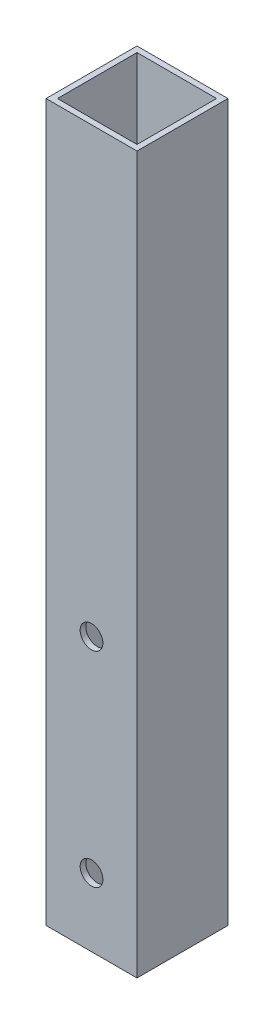
ISO-10303-21;
HEADER;
FILE_DESCRIPTION(('STEP AP214'),'2;1');
FILE_NAME('part.step','',(''),(''),'','','');
FILE_SCHEMA(('AUTOMOTIVE_DESIGN { 1 0 10303 214 1 1 1 1 }'));
ENDSEC;
DATA;
#1=APPLICATION_CONTEXT('core data for automotive mechanical design processes');
#2=APPLICATION_PROTOCOL_DEFINITION('international standard','automotive_design',2000,#1);
#3=PRODUCT_CONTEXT('',#1,'mechanical');
#4=PRODUCT('Part','Part','',(#3));
#5=PRODUCT_RELATED_PRODUCT_CATEGORY('part','',(#4));
#6=PRODUCT_DEFINITION_FORMATION('','',#4);
#7=PRODUCT_DEFINITION_CONTEXT('part definition',#1,'design');
#8=PRODUCT_DEFINITION('design','',#6,#7);
#9=PRODUCT_DEFINITION_SHAPE('','',#8);
#10=(LENGTH_UNIT() NAMED_UNIT(*) SI_UNIT(.MILLI.,.METRE.));
#11=(NAMED_UNIT(*) PLANE_ANGLE_UNIT() SI_UNIT($,.RADIAN.));
#12=(NAMED_UNIT(*) SI_UNIT($,.STERADIAN.) SOLID_ANGLE_UNIT());
#13=UNCERTAINTY_MEASURE_WITH_UNIT(LENGTH_MEASURE(1.E-05),#10,'distance_accuracy_value','');
#14=(GEOMETRIC_REPRESENTATION_CONTEXT(3) GLOBAL_UNCERTAINTY_ASSIGNED_CONTEXT((#13)) GLOBAL_UNIT_ASSIGNED_CONTEXT((#10,
#11,#12)) REPRESENTATION_CONTEXT('',''));
#15=CARTESIAN_POINT('',(0.,0.,0.));
#16=DIRECTION('',(0.,0.,1.));
#17=DIRECTION('',(1.,0.,0.));
#18=AXIS2_PLACEMENT_3D('',#15,#16,#17);
#19=CARTESIAN_POINT('',(0.,200.,0.));
#20=DIRECTION('',(0.,-1.,0.));
#21=DIRECTION('',(0.,0.,-1.));
#22=AXIS2_PLACEMENT_3D('',#19,#20,#21);
#23=PLANE('',#22);
#24=DIRECTION('',(0.,0.,-1.));
#25=VECTOR('',#24,1.);
#26=CARTESIAN_POINT('',(12.7,200.,12.7));
#27=LINE('',#26,#25);
#28=CARTESIAN_POINT('',(12.7,200.,12.7));
#29=VERTEX_POINT('',#28);
#30=CARTESIAN_POINT('',(12.7,200.,-12.7));
#31=VERTEX_POINT('',#30);
#32=EDGE_CURVE('E138',#29,#31,#27,.T.);
#33=ORIENTED_EDGE('',*,*,#32,.T.);
#34=DIRECTION('',(-1.,0.,0.));
#35=VECTOR('',#34,1.);
#36=CARTESIAN_POINT('',(-12.7,200.,-12.7));
#37=LINE('',#36,#35);
#38=CARTESIAN_POINT('',(-12.7,200.,-12.7));
#39=VERTEX_POINT('',#38);
#40=EDGE_CURVE('E141',#31,#39,#37,.T.);
#41=ORIENTED_EDGE('',*,*,#40,.T.);
#42=DIRECTION('',(0.,0.,1.));
#43=VECTOR('',#42,1.);
#44=CARTESIAN_POINT('',(-12.7,200.,12.7));
#45=LINE('',#44,#43);
#46=CARTESIAN_POINT('',(-12.7,200.,12.7));
#47=VERTEX_POINT('',#46);
#48=EDGE_CURVE('E144',#39,#47,#45,.T.);
#49=ORIENTED_EDGE('',*,*,#48,.T.);
#50=DIRECTION('',(1.,0.,0.));
#51=VECTOR('',#50,1.);
#52=CARTESIAN_POINT('',(-12.7,200.,12.7));
#53=LINE('',#52,#51);
#54=EDGE_CURVE('E146',#47,#29,#53,.T.);
#55=ORIENTED_EDGE('',*,*,#54,.T.);
#56=EDGE_LOOP('',(#33,#41,#49,#55));
#57=FACE_BOUND('',#56,.T.);
#58=DIRECTION('',(0.,0.,-1.));
#59=VECTOR('',#58,1.);
#60=CARTESIAN_POINT('',(11.1125,200.,11.1125));
#61=LINE('',#60,#59);
#62=CARTESIAN_POINT('',(11.1125,200.,11.1125));
#63=VERTEX_POINT('',#62);
#64=CARTESIAN_POINT('',(11.1125,200.,-11.1125));
#65=VERTEX_POINT('',#64);
#66=EDGE_CURVE('E100',#63,#65,#61,.T.);
#67=ORIENTED_EDGE('',*,*,#66,.F.);
#68=DIRECTION('',(1.,0.,0.));
#69=VECTOR('',#68,1.);
#70=CARTESIAN_POINT('',(-11.1125,200.,11.1125));
#71=LINE('',#70,#69);
#72=CARTESIAN_POINT('',(-11.1125,200.,11.1125));
#73=VERTEX_POINT('',#72);
#74=EDGE_CURVE('E122',#73,#63,#71,.T.);
#75=ORIENTED_EDGE('',*,*,#74,.F.);
#76=DIRECTION('',(0.,0.,1.));
#77=VECTOR('',#76,1.);
#78=CARTESIAN_POINT('',(-11.1125,200.,11.1125));
#79=LINE('',#78,#77);
#80=CARTESIAN_POINT('',(-11.1125,200.,-11.1125));
#81=VERTEX_POINT('',#80);
#82=EDGE_CURVE('E120',#81,#73,#79,.T.);
#83=ORIENTED_EDGE('',*,*,#82,.F.);
#84=DIRECTION('',(-1.,0.,0.));
#85=VECTOR('',#84,1.);
#86=CARTESIAN_POINT('',(-11.1125,200.,-11.1125));
#87=LINE('',#86,#85);
#88=EDGE_CURVE('E108',#65,#81,#87,.T.);
#89=ORIENTED_EDGE('',*,*,#88,.F.);
#90=EDGE_LOOP('',(#67,#75,#83,#89));
#91=FACE_BOUND('',#90,.T.);
#92=ADVANCED_FACE('F33',(#57,#91),#23,.F.);
#93=CARTESIAN_POINT('',(0.,0.,0.));
#94=DIRECTION('',(0.,-1.,0.));
#95=DIRECTION('',(0.,0.,-1.));
#96=AXIS2_PLACEMENT_3D('',#93,#94,#95);
#97=PLANE('',#96);
#98=DIRECTION('',(0.,0.,-1.));
#99=VECTOR('',#98,1.);
#100=CARTESIAN_POINT('',(12.7,0.,12.7));
#101=LINE('',#100,#99);
#102=CARTESIAN_POINT('',(12.7,0.,12.7));
#103=VERTEX_POINT('',#102);
#104=CARTESIAN_POINT('',(12.7,0.,-12.7));
#105=VERTEX_POINT('',#104);
#106=EDGE_CURVE('E116',#103,#105,#101,.T.);
#107=ORIENTED_EDGE('',*,*,#106,.F.);
#108=DIRECTION('',(1.,0.,0.));
#109=VECTOR('',#108,1.);
#110=CARTESIAN_POINT('',(-12.7,0.,12.7));
#111=LINE('',#110,#109);
#112=CARTESIAN_POINT('',(-12.7,0.,12.7));
#113=VERTEX_POINT('',#112);
#114=EDGE_CURVE('E142',#113,#103,#111,.T.);
#115=ORIENTED_EDGE('',*,*,#114,.F.);
#116=DIRECTION('',(0.,0.,1.));
#117=VECTOR('',#116,1.);
#118=CARTESIAN_POINT('',(-12.7,0.,12.7));
#119=LINE('',#118,#117);
#120=CARTESIAN_POINT('',(-12.7,0.,-12.7));
#121=VERTEX_POINT('',#120);
#122=EDGE_CURVE('E153',#121,#113,#119,.T.);
#123=ORIENTED_EDGE('',*,*,#122,.F.);
#124=DIRECTION('',(-1.,0.,0.));
#125=VECTOR('',#124,1.);
#126=CARTESIAN_POINT('',(-12.7,0.,-12.7));
#127=LINE('',#126,#125);
#128=EDGE_CURVE('E151',#105,#121,#127,.T.);
#129=ORIENTED_EDGE('',*,*,#128,.F.);
#130=EDGE_LOOP('',(#107,#115,#123,#129));
#131=FACE_BOUND('',#130,.T.);
#132=DIRECTION('',(1.,0.,0.));
#133=VECTOR('',#132,1.);
#134=CARTESIAN_POINT('',(-11.1125,0.,11.1125));
#135=LINE('',#134,#133);
#136=CARTESIAN_POINT('',(-11.1125,0.,11.1125));
#137=VERTEX_POINT('',#136);
#138=CARTESIAN_POINT('',(11.1125,0.,11.1125));
#139=VERTEX_POINT('',#138);
#140=EDGE_CURVE('E109',#137,#139,#135,.T.);
#141=ORIENTED_EDGE('',*,*,#140,.T.);
#142=DIRECTION('',(0.,0.,-1.));
#143=VECTOR('',#142,1.);
#144=CARTESIAN_POINT('',(11.1125,0.,11.1125));
#145=LINE('',#144,#143);
#146=CARTESIAN_POINT('',(11.1125,0.,-11.1125));
#147=VERTEX_POINT('',#146);
#148=EDGE_CURVE('E58',#139,#147,#145,.T.);
#149=ORIENTED_EDGE('',*,*,#148,.T.);
#150=DIRECTION('',(-1.,0.,0.));
#151=VECTOR('',#150,1.);
#152=CARTESIAN_POINT('',(-11.1125,0.,-11.1125));
#153=LINE('',#152,#151);
#154=CARTESIAN_POINT('',(-11.1125,0.,-11.1125));
#155=VERTEX_POINT('',#154);
#156=EDGE_CURVE('E115',#147,#155,#153,.T.);
#157=ORIENTED_EDGE('',*,*,#156,.T.);
#158=DIRECTION('',(0.,0.,1.));
#159=VECTOR('',#158,1.);
#160=CARTESIAN_POINT('',(-11.1125,0.,11.1125));
#161=LINE('',#160,#159);
#162=EDGE_CURVE('E130',#155,#137,#161,.T.);
#163=ORIENTED_EDGE('',*,*,#162,.T.);
#164=EDGE_LOOP('',(#141,#149,#157,#163));
#165=FACE_BOUND('',#164,.T.);
#166=ADVANCED_FACE('F200',(#131,#165),#97,.T.);
#167=CARTESIAN_POINT('',(12.7,200.,12.7));
#168=DIRECTION('',(-1.,0.,0.));
#169=DIRECTION('',(0.,0.,1.));
#170=AXIS2_PLACEMENT_3D('',#167,#168,#169);
#171=PLANE('',#170);
#172=ORIENTED_EDGE('',*,*,#106,.T.);
#173=DIRECTION('',(0.,-1.,0.));
#174=VECTOR('',#173,1.);
#175=CARTESIAN_POINT('',(12.7,200.,-12.7));
#176=LINE('',#175,#174);
#177=EDGE_CURVE('E11',#31,#105,#176,.T.);
#178=ORIENTED_EDGE('',*,*,#177,.F.);
#179=ORIENTED_EDGE('',*,*,#32,.F.);
#180=DIRECTION('',(0.,-1.,0.));
#181=VECTOR('',#180,1.);
#182=CARTESIAN_POINT('',(12.7,200.,12.7));
#183=LINE('',#182,#181);
#184=EDGE_CURVE('E148',#29,#103,#183,.T.);
#185=ORIENTED_EDGE('',*,*,#184,.T.);
#186=EDGE_LOOP('',(#172,#178,#179,#185));
#187=FACE_BOUND('',#186,.T.);
#188=ADVANCED_FACE('F35',(#187),#171,.F.);
#189=CARTESIAN_POINT('',(-12.7,200.,-12.7));
#190=DIRECTION('',(0.,0.,1.));
#191=DIRECTION('',(1.,0.,0.));
#192=AXIS2_PLACEMENT_3D('',#189,#190,#191);
#193=PLANE('',#192);
#194=CARTESIAN_POINT('',(0.,19.05,-12.7));
#195=DIRECTION('',(0.,0.,-1.));
#196=DIRECTION('',(-1.,0.,0.));
#197=AXIS2_PLACEMENT_3D('',#194,#195,#196);
#198=CIRCLE('',#197,3.175);
#199=CARTESIAN_POINT('',(-3.175,19.05,-12.7));
#200=VERTEX_POINT('',#199);
#201=EDGE_CURVE('E179',#200,#200,#198,.T.);
#202=ORIENTED_EDGE('',*,*,#201,.F.);
#203=EDGE_LOOP('',(#202));
#204=FACE_BOUND('',#203,.T.);
#205=CARTESIAN_POINT('',(0.,76.2,-12.7));
#206=DIRECTION('',(0.,0.,-1.));
#207=DIRECTION('',(-1.,0.,0.));
#208=AXIS2_PLACEMENT_3D('',#205,#206,#207);
#209=CIRCLE('',#208,3.175);
#210=CARTESIAN_POINT('',(-3.175,76.2,-12.7));
#211=VERTEX_POINT('',#210);
#212=EDGE_CURVE('E169',#211,#211,#209,.T.);
#213=ORIENTED_EDGE('',*,*,#212,.F.);
#214=EDGE_LOOP('',(#213));
#215=FACE_BOUND('',#214,.T.);
#216=ORIENTED_EDGE('',*,*,#128,.T.);
#217=DIRECTION('',(0.,-1.,0.));
#218=VECTOR('',#217,1.);
#219=CARTESIAN_POINT('',(-12.7,200.,-12.7));
#220=LINE('',#219,#218);
#221=EDGE_CURVE('E42',#39,#121,#220,.T.);
#222=ORIENTED_EDGE('',*,*,#221,.F.);
#223=ORIENTED_EDGE('',*,*,#40,.F.);
#224=ORIENTED_EDGE('',*,*,#177,.T.);
#225=EDGE_LOOP('',(#216,#222,#223,#224));
#226=FACE_BOUND('',#225,.T.);
#227=ADVANCED_FACE('F224',(#204,#215,#226),#193,.F.);
#228=CARTESIAN_POINT('',(-12.7,200.,12.7));
#229=DIRECTION('',(1.,0.,0.));
#230=DIRECTION('',(0.,0.,-1.));
#231=AXIS2_PLACEMENT_3D('',#228,#229,#230);
#232=PLANE('',#231);
#233=ORIENTED_EDGE('',*,*,#122,.T.);
#234=DIRECTION('',(0.,-1.,0.));
#235=VECTOR('',#234,1.);
#236=CARTESIAN_POINT('',(-12.7,200.,12.7));
#237=LINE('',#236,#235);
#238=EDGE_CURVE('E158',#47,#113,#237,.T.);
#239=ORIENTED_EDGE('',*,*,#238,.F.);
#240=ORIENTED_EDGE('',*,*,#48,.F.);
#241=ORIENTED_EDGE('',*,*,#221,.T.);
#242=EDGE_LOOP('',(#233,#239,#240,#241));
#243=FACE_BOUND('',#242,.T.);
#244=ADVANCED_FACE('F222',(#243),#232,.F.);
#245=CARTESIAN_POINT('',(-12.7,200.,12.7));
#246=DIRECTION('',(0.,0.,-1.));
#247=DIRECTION('',(-1.,0.,0.));
#248=AXIS2_PLACEMENT_3D('',#245,#246,#247);
#249=PLANE('',#248);
#250=CARTESIAN_POINT('',(0.,19.05,12.7));
#251=DIRECTION('',(0.,0.,-1.));
#252=DIRECTION('',(-1.,0.,0.));
#253=AXIS2_PLACEMENT_3D('',#250,#251,#252);
#254=CIRCLE('',#253,3.175);
#255=CARTESIAN_POINT('',(-3.175,19.05,12.7));
#256=VERTEX_POINT('',#255);
#257=EDGE_CURVE('E182',#256,#256,#254,.T.);
#258=ORIENTED_EDGE('',*,*,#257,.T.);
#259=EDGE_LOOP('',(#258));
#260=FACE_BOUND('',#259,.T.);
#261=CARTESIAN_POINT('',(0.,76.2,12.7));
#262=DIRECTION('',(0.,0.,-1.));
#263=DIRECTION('',(-1.,0.,0.));
#264=AXIS2_PLACEMENT_3D('',#261,#262,#263);
#265=CIRCLE('',#264,3.175);
#266=CARTESIAN_POINT('',(-3.175,76.2,12.7));
#267=VERTEX_POINT('',#266);
#268=EDGE_CURVE('E164',#267,#267,#265,.T.);
#269=ORIENTED_EDGE('',*,*,#268,.T.);
#270=EDGE_LOOP('',(#269));
#271=FACE_BOUND('',#270,.T.);
#272=ORIENTED_EDGE('',*,*,#114,.T.);
#273=ORIENTED_EDGE('',*,*,#184,.F.);
#274=ORIENTED_EDGE('',*,*,#54,.F.);
#275=ORIENTED_EDGE('',*,*,#238,.T.);
#276=EDGE_LOOP('',(#272,#273,#274,#275));
#277=FACE_BOUND('',#276,.T.);
#278=ADVANCED_FACE('F219',(#260,#271,#277),#249,.F.);
#279=CARTESIAN_POINT('',(11.1125,200.,11.1125));
#280=DIRECTION('',(-1.,0.,0.));
#281=DIRECTION('',(0.,0.,1.));
#282=AXIS2_PLACEMENT_3D('',#279,#280,#281);
#283=PLANE('',#282);
#284=ORIENTED_EDGE('',*,*,#148,.F.);
#285=DIRECTION('',(0.,-1.,0.));
#286=VECTOR('',#285,1.);
#287=CARTESIAN_POINT('',(11.1125,200.,11.1125));
#288=LINE('',#287,#286);
#289=EDGE_CURVE('E104',#63,#139,#288,.T.);
#290=ORIENTED_EDGE('',*,*,#289,.F.);
#291=ORIENTED_EDGE('',*,*,#66,.T.);
#292=DIRECTION('',(0.,-1.,0.));
#293=VECTOR('',#292,1.);
#294=CARTESIAN_POINT('',(11.1125,200.,-11.1125));
#295=LINE('',#294,#293);
#296=EDGE_CURVE('E103',#65,#147,#295,.T.);
#297=ORIENTED_EDGE('',*,*,#296,.T.);
#298=EDGE_LOOP('',(#284,#290,#291,#297));
#299=FACE_BOUND('',#298,.T.);
#300=ADVANCED_FACE('F102',(#299),#283,.T.);
#301=CARTESIAN_POINT('',(-11.1125,200.,-11.1125));
#302=DIRECTION('',(0.,0.,1.));
#303=DIRECTION('',(1.,0.,0.));
#304=AXIS2_PLACEMENT_3D('',#301,#302,#303);
#305=PLANE('',#304);
#306=CARTESIAN_POINT('',(0.,19.05,-11.1125));
#307=DIRECTION('',(0.,0.,1.));
#308=DIRECTION('',(1.,0.,0.));
#309=AXIS2_PLACEMENT_3D('',#306,#307,#308);
#310=CIRCLE('',#309,3.175);
#311=CARTESIAN_POINT('',(3.175,19.05,-11.1125));
#312=VERTEX_POINT('',#311);
#313=EDGE_CURVE('E174',#312,#312,#310,.T.);
#314=ORIENTED_EDGE('',*,*,#313,.F.);
#315=EDGE_LOOP('',(#314));
#316=FACE_BOUND('',#315,.T.);
#317=CARTESIAN_POINT('',(0.,76.2,-11.1125));
#318=DIRECTION('',(0.,0.,1.));
#319=DIRECTION('',(1.,0.,0.));
#320=AXIS2_PLACEMENT_3D('',#317,#318,#319);
#321=CIRCLE('',#320,3.175);
#322=CARTESIAN_POINT('',(3.175,76.2,-11.1125));
#323=VERTEX_POINT('',#322);
#324=EDGE_CURVE('E128',#323,#323,#321,.T.);
#325=ORIENTED_EDGE('',*,*,#324,.F.);
#326=EDGE_LOOP('',(#325));
#327=FACE_BOUND('',#326,.T.);
#328=ORIENTED_EDGE('',*,*,#156,.F.);
#329=ORIENTED_EDGE('',*,*,#296,.F.);
#330=ORIENTED_EDGE('',*,*,#88,.T.);
#331=DIRECTION('',(0.,-1.,0.));
#332=VECTOR('',#331,1.);
#333=CARTESIAN_POINT('',(-11.1125,200.,-11.1125));
#334=LINE('',#333,#332);
#335=EDGE_CURVE('E117',#81,#155,#334,.T.);
#336=ORIENTED_EDGE('',*,*,#335,.T.);
#337=EDGE_LOOP('',(#328,#329,#330,#336));
#338=FACE_BOUND('',#337,.T.);
#339=ADVANCED_FACE('F112',(#316,#327,#338),#305,.T.);
#340=CARTESIAN_POINT('',(-11.1125,200.,11.1125));
#341=DIRECTION('',(1.,0.,0.));
#342=DIRECTION('',(0.,0.,-1.));
#343=AXIS2_PLACEMENT_3D('',#340,#341,#342);
#344=PLANE('',#343);
#345=ORIENTED_EDGE('',*,*,#162,.F.);
#346=ORIENTED_EDGE('',*,*,#335,.F.);
#347=ORIENTED_EDGE('',*,*,#82,.T.);
#348=DIRECTION('',(0.,-1.,0.));
#349=VECTOR('',#348,1.);
#350=CARTESIAN_POINT('',(-11.1125,200.,11.1125));
#351=LINE('',#350,#349);
#352=EDGE_CURVE('E50',#73,#137,#351,.T.);
#353=ORIENTED_EDGE('',*,*,#352,.T.);
#354=EDGE_LOOP('',(#345,#346,#347,#353));
#355=FACE_BOUND('',#354,.T.);
#356=ADVANCED_FACE('F196',(#355),#344,.T.);
#357=CARTESIAN_POINT('',(-11.1125,200.,11.1125));
#358=DIRECTION('',(0.,0.,-1.));
#359=DIRECTION('',(-1.,0.,0.));
#360=AXIS2_PLACEMENT_3D('',#357,#358,#359);
#361=PLANE('',#360);
#362=CARTESIAN_POINT('',(0.,19.05,11.1125));
#363=DIRECTION('',(0.,0.,-1.));
#364=DIRECTION('',(-1.,0.,0.));
#365=AXIS2_PLACEMENT_3D('',#362,#363,#364);
#366=CIRCLE('',#365,3.175);
#367=CARTESIAN_POINT('',(-3.175,19.05,11.1125));
#368=VERTEX_POINT('',#367);
#369=EDGE_CURVE('E37',#368,#368,#366,.T.);
#370=ORIENTED_EDGE('',*,*,#369,.F.);
#371=EDGE_LOOP('',(#370));
#372=FACE_BOUND('',#371,.T.);
#373=CARTESIAN_POINT('',(0.,76.2,11.1125));
#374=DIRECTION('',(0.,0.,-1.));
#375=DIRECTION('',(-1.,0.,0.));
#376=AXIS2_PLACEMENT_3D('',#373,#374,#375);
#377=CIRCLE('',#376,3.175);
#378=CARTESIAN_POINT('',(-3.175,76.2,11.1125));
#379=VERTEX_POINT('',#378);
#380=EDGE_CURVE('E162',#379,#379,#377,.T.);
#381=ORIENTED_EDGE('',*,*,#380,.F.);
#382=EDGE_LOOP('',(#381));
#383=FACE_BOUND('',#382,.T.);
#384=ORIENTED_EDGE('',*,*,#140,.F.);
#385=ORIENTED_EDGE('',*,*,#352,.F.);
#386=ORIENTED_EDGE('',*,*,#74,.T.);
#387=ORIENTED_EDGE('',*,*,#289,.T.);
#388=EDGE_LOOP('',(#384,#385,#386,#387));
#389=FACE_BOUND('',#388,.T.);
#390=ADVANCED_FACE('F192',(#372,#383,#389),#361,.T.);
#391=CARTESIAN_POINT('',(0.,76.2,12.7));
#392=DIRECTION('',(0.,0.,-1.));
#393=DIRECTION('',(-1.,0.,0.));
#394=AXIS2_PLACEMENT_3D('',#391,#392,#393);
#395=CYLINDRICAL_SURFACE('',#394,3.175);
#396=ORIENTED_EDGE('',*,*,#380,.T.);
#397=EDGE_LOOP('',(#396));
#398=FACE_BOUND('',#397,.T.);
#399=ORIENTED_EDGE('',*,*,#268,.F.);
#400=EDGE_LOOP('',(#399));
#401=FACE_BOUND('',#400,.T.);
#402=ADVANCED_FACE('F195',(#398,#401),#395,.F.);
#403=ORIENTED_EDGE('',*,*,#324,.T.);
#404=EDGE_LOOP('',(#403));
#405=FACE_BOUND('',#404,.T.);
#406=ORIENTED_EDGE('',*,*,#212,.T.);
#407=EDGE_LOOP('',(#406));
#408=FACE_BOUND('',#407,.T.);
#409=ADVANCED_FACE('F248',(#405,#408),#395,.F.);
#410=CARTESIAN_POINT('',(0.,19.05,12.7));
#411=DIRECTION('',(0.,0.,-1.));
#412=DIRECTION('',(-1.,0.,0.));
#413=AXIS2_PLACEMENT_3D('',#410,#411,#412);
#414=CYLINDRICAL_SURFACE('',#413,3.175);
#415=ORIENTED_EDGE('',*,*,#369,.T.);
#416=EDGE_LOOP('',(#415));
#417=FACE_BOUND('',#416,.T.);
#418=ORIENTED_EDGE('',*,*,#257,.F.);
#419=EDGE_LOOP('',(#418));
#420=FACE_BOUND('',#419,.T.);
#421=ADVANCED_FACE('F189',(#417,#420),#414,.F.);
#422=ORIENTED_EDGE('',*,*,#313,.T.);
#423=EDGE_LOOP('',(#422));
#424=FACE_BOUND('',#423,.T.);
#425=ORIENTED_EDGE('',*,*,#201,.T.);
#426=EDGE_LOOP('',(#425));
#427=FACE_BOUND('',#426,.T.);
#428=ADVANCED_FACE('F256',(#424,#427),#414,.F.);
#429=CLOSED_SHELL('',(#92,#166,#188,#227,#244,#278,#300,#339,#356,#390,#402,#409,#421,#428));
#430=MANIFOLD_SOLID_BREP('B2',#429);
#431=ADVANCED_BREP_SHAPE_REPRESENTATION('',(#18,#430),#14);
#432=SHAPE_DEFINITION_REPRESENTATION(#9,#431);
ENDSEC;
END-ISO-10303-21;
